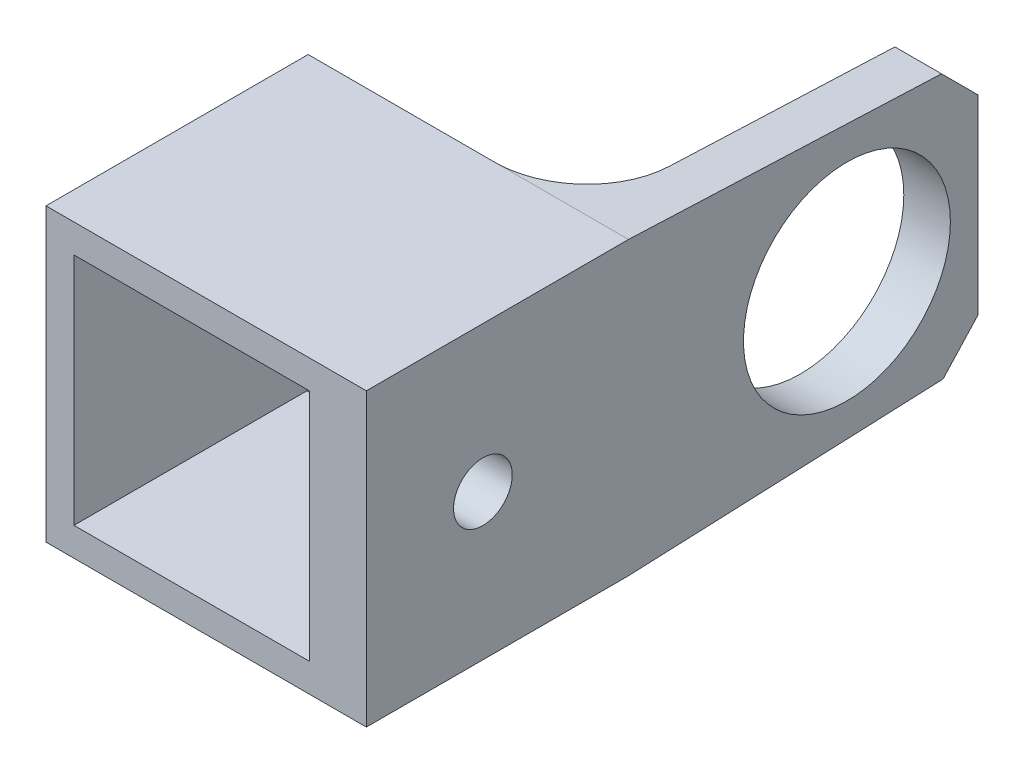
ISO-10303-21;
HEADER;
FILE_DESCRIPTION(('STEP AP214'),'2;1');
FILE_NAME('part.step','',(''),(''),'','','');
FILE_SCHEMA(('AUTOMOTIVE_DESIGN { 1 0 10303 214 1 1 1 1 }'));
ENDSEC;
DATA;
#1=APPLICATION_CONTEXT('core data for automotive mechanical design processes');
#2=APPLICATION_PROTOCOL_DEFINITION('international standard','automotive_design',2000,#1);
#3=PRODUCT_CONTEXT('',#1,'mechanical');
#4=PRODUCT('Part','Part','',(#3));
#5=PRODUCT_RELATED_PRODUCT_CATEGORY('part','',(#4));
#6=PRODUCT_DEFINITION_FORMATION('','',#4);
#7=PRODUCT_DEFINITION_CONTEXT('part definition',#1,'design');
#8=PRODUCT_DEFINITION('design','',#6,#7);
#9=PRODUCT_DEFINITION_SHAPE('','',#8);
#10=(LENGTH_UNIT() NAMED_UNIT(*) SI_UNIT(.MILLI.,.METRE.));
#11=(NAMED_UNIT(*) PLANE_ANGLE_UNIT() SI_UNIT($,.RADIAN.));
#12=(NAMED_UNIT(*) SI_UNIT($,.STERADIAN.) SOLID_ANGLE_UNIT());
#13=UNCERTAINTY_MEASURE_WITH_UNIT(LENGTH_MEASURE(1.E-05),#10,'distance_accuracy_value','');
#14=(GEOMETRIC_REPRESENTATION_CONTEXT(3) GLOBAL_UNCERTAINTY_ASSIGNED_CONTEXT((#13)) GLOBAL_UNIT_ASSIGNED_CONTEXT((#10,
#11,#12)) REPRESENTATION_CONTEXT('',''));
#15=CARTESIAN_POINT('',(0.,0.,0.));
#16=DIRECTION('',(0.,0.,1.));
#17=DIRECTION('',(1.,0.,0.));
#18=AXIS2_PLACEMENT_3D('',#15,#16,#17);
#19=CARTESIAN_POINT('',(-15.875,15.875,28.575));
#20=DIRECTION('',(0.,-1.,0.));
#21=DIRECTION('',(0.,0.,-1.));
#22=AXIS2_PLACEMENT_3D('',#19,#20,#21);
#23=PLANE('',#22);
#24=DIRECTION('',(-1.,0.,0.));
#25=VECTOR('',#24,1.);
#26=CARTESIAN_POINT('',(-15.875,15.875,0.));
#27=LINE('',#26,#25);
#28=CARTESIAN_POINT('',(19.05,15.875,0.));
#29=VERTEX_POINT('',#28);
#30=CARTESIAN_POINT('',(4.445,15.875,0.));
#31=VERTEX_POINT('',#30);
#32=EDGE_CURVE('E248',#29,#31,#27,.T.);
#33=ORIENTED_EDGE('',*,*,#32,.T.);
#34=CARTESIAN_POINT('',(-15.875,15.875,0.));
#35=VERTEX_POINT('',#34);
#36=EDGE_CURVE('E235',#31,#35,#27,.T.);
#37=ORIENTED_EDGE('',*,*,#36,.T.);
#38=DIRECTION('',(0.,0.,-1.));
#39=VECTOR('',#38,1.);
#40=CARTESIAN_POINT('',(-15.875,15.875,28.575));
#41=LINE('',#40,#39);
#42=CARTESIAN_POINT('',(-15.875,15.875,28.575));
#43=VERTEX_POINT('',#42);
#44=EDGE_CURVE('E259',#43,#35,#41,.T.);
#45=ORIENTED_EDGE('',*,*,#44,.F.);
#46=DIRECTION('',(-1.,0.,0.));
#47=VECTOR('',#46,1.);
#48=CARTESIAN_POINT('',(-15.875,15.875,28.575));
#49=LINE('',#48,#47);
#50=CARTESIAN_POINT('',(19.05,15.875,28.575));
#51=VERTEX_POINT('',#50);
#52=EDGE_CURVE('E242',#51,#43,#49,.T.);
#53=ORIENTED_EDGE('',*,*,#52,.F.);
#54=DIRECTION('',(0.,0.,1.));
#55=VECTOR('',#54,1.);
#56=CARTESIAN_POINT('',(19.05,15.875,28.575));
#57=LINE('',#56,#55);
#58=EDGE_CURVE('E179',#29,#51,#57,.T.);
#59=ORIENTED_EDGE('',*,*,#58,.F.);
#60=EDGE_LOOP('',(#33,#37,#45,#53,#59));
#61=FACE_BOUND('',#60,.T.);
#62=ADVANCED_FACE('F46',(#61),#23,.F.);
#63=CARTESIAN_POINT('',(-15.875,-15.875,28.575));
#64=DIRECTION('',(1.,0.,0.));
#65=DIRECTION('',(0.,0.,-1.));
#66=AXIS2_PLACEMENT_3D('',#63,#64,#65);
#67=PLANE('',#66);
#68=DIRECTION('',(0.,-1.,0.));
#69=VECTOR('',#68,1.);
#70=CARTESIAN_POINT('',(-15.875,-15.875,0.));
#71=LINE('',#70,#69);
#72=CARTESIAN_POINT('',(-15.875,-15.875,0.));
#73=VERTEX_POINT('',#72);
#74=EDGE_CURVE('E252',#35,#73,#71,.T.);
#75=ORIENTED_EDGE('',*,*,#74,.T.);
#76=DIRECTION('',(0.,0.,-1.));
#77=VECTOR('',#76,1.);
#78=CARTESIAN_POINT('',(-15.875,-15.875,28.575));
#79=LINE('',#78,#77);
#80=CARTESIAN_POINT('',(-15.875,-15.875,28.575));
#81=VERTEX_POINT('',#80);
#82=EDGE_CURVE('E162',#81,#73,#79,.T.);
#83=ORIENTED_EDGE('',*,*,#82,.F.);
#84=DIRECTION('',(0.,-1.,0.));
#85=VECTOR('',#84,1.);
#86=CARTESIAN_POINT('',(-15.875,-15.875,28.575));
#87=LINE('',#86,#85);
#88=EDGE_CURVE('E158',#43,#81,#87,.T.);
#89=ORIENTED_EDGE('',*,*,#88,.F.);
#90=ORIENTED_EDGE('',*,*,#44,.T.);
#91=EDGE_LOOP('',(#75,#83,#89,#90));
#92=FACE_BOUND('',#91,.T.);
#93=ADVANCED_FACE('F378',(#92),#67,.F.);
#94=CARTESIAN_POINT('',(-15.875,-15.875,28.575));
#95=DIRECTION('',(0.,1.,0.));
#96=DIRECTION('',(0.,0.,1.));
#97=AXIS2_PLACEMENT_3D('',#94,#95,#96);
#98=PLANE('',#97);
#99=DIRECTION('',(1.,0.,0.));
#100=VECTOR('',#99,1.);
#101=CARTESIAN_POINT('',(-15.875,-15.875,0.));
#102=LINE('',#101,#100);
#103=CARTESIAN_POINT('',(4.445,-15.875,0.));
#104=VERTEX_POINT('',#103);
#105=EDGE_CURVE('E249',#73,#104,#102,.T.);
#106=ORIENTED_EDGE('',*,*,#105,.T.);
#107=DIRECTION('',(-1.,0.,0.));
#108=VECTOR('',#107,1.);
#109=CARTESIAN_POINT('',(19.05,-15.875,0.));
#110=LINE('',#109,#108);
#111=CARTESIAN_POINT('',(19.05,-15.875,0.));
#112=VERTEX_POINT('',#111);
#113=EDGE_CURVE('E166',#112,#104,#110,.T.);
#114=ORIENTED_EDGE('',*,*,#113,.F.);
#115=DIRECTION('',(0.,0.,-1.));
#116=VECTOR('',#115,1.);
#117=CARTESIAN_POINT('',(19.05,-15.875,28.575));
#118=LINE('',#117,#116);
#119=CARTESIAN_POINT('',(19.05,-15.875,28.575));
#120=VERTEX_POINT('',#119);
#121=EDGE_CURVE('E167',#120,#112,#118,.T.);
#122=ORIENTED_EDGE('',*,*,#121,.F.);
#123=DIRECTION('',(1.,0.,0.));
#124=VECTOR('',#123,1.);
#125=CARTESIAN_POINT('',(-15.875,-15.875,28.575));
#126=LINE('',#125,#124);
#127=EDGE_CURVE('E155',#81,#120,#126,.T.);
#128=ORIENTED_EDGE('',*,*,#127,.F.);
#129=ORIENTED_EDGE('',*,*,#82,.T.);
#130=EDGE_LOOP('',(#106,#114,#122,#128,#129));
#131=FACE_BOUND('',#130,.T.);
#132=ADVANCED_FACE('F169',(#131),#98,.F.);
#133=CARTESIAN_POINT('',(0.,0.,28.575));
#134=DIRECTION('',(0.,0.,-1.));
#135=DIRECTION('',(-1.,0.,0.));
#136=AXIS2_PLACEMENT_3D('',#133,#134,#135);
#137=PLANE('',#136);
#138=DIRECTION('',(-1.,0.,0.));
#139=VECTOR('',#138,1.);
#140=CARTESIAN_POINT('',(-12.827,12.7635,28.575));
#141=LINE('',#140,#139);
#142=CARTESIAN_POINT('',(12.827,12.7635,28.575));
#143=VERTEX_POINT('',#142);
#144=CARTESIAN_POINT('',(-12.827,12.7635,28.575));
#145=VERTEX_POINT('',#144);
#146=EDGE_CURVE('E218',#143,#145,#141,.T.);
#147=ORIENTED_EDGE('',*,*,#146,.F.);
#148=DIRECTION('',(0.,1.,0.));
#149=VECTOR('',#148,1.);
#150=CARTESIAN_POINT('',(12.827,-12.7635,28.575));
#151=LINE('',#150,#149);
#152=CARTESIAN_POINT('',(12.827,-12.7635,28.575));
#153=VERTEX_POINT('',#152);
#154=EDGE_CURVE('E196',#153,#143,#151,.T.);
#155=ORIENTED_EDGE('',*,*,#154,.F.);
#156=DIRECTION('',(1.,0.,0.));
#157=VECTOR('',#156,1.);
#158=CARTESIAN_POINT('',(-12.827,-12.7635,28.575));
#159=LINE('',#158,#157);
#160=CARTESIAN_POINT('',(-12.827,-12.7635,28.575));
#161=VERTEX_POINT('',#160);
#162=EDGE_CURVE('E204',#161,#153,#159,.T.);
#163=ORIENTED_EDGE('',*,*,#162,.F.);
#164=DIRECTION('',(0.,-1.,0.));
#165=VECTOR('',#164,1.);
#166=CARTESIAN_POINT('',(-12.827,-12.7635,28.575));
#167=LINE('',#166,#165);
#168=EDGE_CURVE('E224',#145,#161,#167,.T.);
#169=ORIENTED_EDGE('',*,*,#168,.F.);
#170=EDGE_LOOP('',(#147,#155,#163,#169));
#171=FACE_BOUND('',#170,.T.);
#172=ORIENTED_EDGE('',*,*,#127,.T.);
#173=DIRECTION('',(0.,-1.,0.));
#174=VECTOR('',#173,1.);
#175=CARTESIAN_POINT('',(19.05,-15.875,28.575));
#176=LINE('',#175,#174);
#177=EDGE_CURVE('E156',#51,#120,#176,.T.);
#178=ORIENTED_EDGE('',*,*,#177,.F.);
#179=ORIENTED_EDGE('',*,*,#52,.T.);
#180=ORIENTED_EDGE('',*,*,#88,.T.);
#181=EDGE_LOOP('',(#172,#178,#179,#180));
#182=FACE_BOUND('',#181,.T.);
#183=ADVANCED_FACE('F152',(#171,#182),#137,.F.);
#184=CARTESIAN_POINT('',(0.,0.,0.));
#185=DIRECTION('',(0.,0.,-1.));
#186=DIRECTION('',(-1.,0.,0.));
#187=AXIS2_PLACEMENT_3D('',#184,#185,#186);
#188=PLANE('',#187);
#189=ORIENTED_EDGE('',*,*,#36,.F.);
#190=DIRECTION('',(0.,1.,0.));
#191=VECTOR('',#190,1.);
#192=CARTESIAN_POINT('',(4.445,-15.875,0.));
#193=LINE('',#192,#191);
#194=EDGE_CURVE('E270',#31,#104,#193,.F.);
#195=ORIENTED_EDGE('',*,*,#194,.T.);
#196=ORIENTED_EDGE('',*,*,#105,.F.);
#197=ORIENTED_EDGE('',*,*,#74,.F.);
#198=EDGE_LOOP('',(#189,#195,#196,#197));
#199=FACE_BOUND('',#198,.T.);
#200=ADVANCED_FACE('F353',(#199),#188,.T.);
#201=CARTESIAN_POINT('',(12.827,-12.7635,3.175));
#202=DIRECTION('',(1.,0.,0.));
#203=DIRECTION('',(0.,0.,-1.));
#204=AXIS2_PLACEMENT_3D('',#201,#202,#203);
#205=PLANE('',#204);
#206=CARTESIAN_POINT('',(12.827,0.,15.875));
#207=DIRECTION('',(1.,0.,0.));
#208=DIRECTION('',(0.,0.,-1.));
#209=AXIS2_PLACEMENT_3D('',#206,#207,#208);
#210=CIRCLE('',#209,3.2004);
#211=CARTESIAN_POINT('',(12.827,0.,12.6746));
#212=VERTEX_POINT('',#211);
#213=EDGE_CURVE('E325',#212,#212,#210,.F.);
#214=ORIENTED_EDGE('',*,*,#213,.F.);
#215=EDGE_LOOP('',(#214));
#216=FACE_BOUND('',#215,.T.);
#217=ORIENTED_EDGE('',*,*,#154,.T.);
#218=DIRECTION('',(0.,0.,1.));
#219=VECTOR('',#218,1.);
#220=CARTESIAN_POINT('',(12.827,12.7635,3.175));
#221=LINE('',#220,#219);
#222=CARTESIAN_POINT('',(12.827,12.7635,3.175));
#223=VERTEX_POINT('',#222);
#224=EDGE_CURVE('E216',#223,#143,#221,.T.);
#225=ORIENTED_EDGE('',*,*,#224,.F.);
#226=DIRECTION('',(0.,1.,0.));
#227=VECTOR('',#226,1.);
#228=CARTESIAN_POINT('',(12.827,-12.7635,3.175));
#229=LINE('',#228,#227);
#230=CARTESIAN_POINT('',(12.827,-12.7635,3.175));
#231=VERTEX_POINT('',#230);
#232=EDGE_CURVE('E200',#231,#223,#229,.T.);
#233=ORIENTED_EDGE('',*,*,#232,.F.);
#234=DIRECTION('',(0.,0.,1.));
#235=VECTOR('',#234,1.);
#236=CARTESIAN_POINT('',(12.827,-12.7635,3.175));
#237=LINE('',#236,#235);
#238=EDGE_CURVE('E226',#231,#153,#237,.T.);
#239=ORIENTED_EDGE('',*,*,#238,.T.);
#240=EDGE_LOOP('',(#217,#225,#233,#239));
#241=FACE_BOUND('',#240,.T.);
#242=ADVANCED_FACE('F350',(#216,#241),#205,.F.);
#243=CARTESIAN_POINT('',(-12.827,-12.7635,3.175));
#244=DIRECTION('',(0.,-1.,0.));
#245=DIRECTION('',(0.,0.,-1.));
#246=AXIS2_PLACEMENT_3D('',#243,#244,#245);
#247=PLANE('',#246);
#248=ORIENTED_EDGE('',*,*,#162,.T.);
#249=ORIENTED_EDGE('',*,*,#238,.F.);
#250=DIRECTION('',(1.,0.,0.));
#251=VECTOR('',#250,1.);
#252=CARTESIAN_POINT('',(-12.827,-12.7635,3.175));
#253=LINE('',#252,#251);
#254=CARTESIAN_POINT('',(-12.827,-12.7635,3.175));
#255=VERTEX_POINT('',#254);
#256=EDGE_CURVE('E215',#255,#231,#253,.T.);
#257=ORIENTED_EDGE('',*,*,#256,.F.);
#258=DIRECTION('',(0.,0.,1.));
#259=VECTOR('',#258,1.);
#260=CARTESIAN_POINT('',(-12.827,-12.7635,3.175));
#261=LINE('',#260,#259);
#262=EDGE_CURVE('E233',#255,#161,#261,.T.);
#263=ORIENTED_EDGE('',*,*,#262,.T.);
#264=EDGE_LOOP('',(#248,#249,#257,#263));
#265=FACE_BOUND('',#264,.T.);
#266=ADVANCED_FACE('F348',(#265),#247,.F.);
#267=CARTESIAN_POINT('',(-12.827,-12.7635,3.175));
#268=DIRECTION('',(-1.,0.,0.));
#269=DIRECTION('',(0.,0.,1.));
#270=AXIS2_PLACEMENT_3D('',#267,#268,#269);
#271=PLANE('',#270);
#272=ORIENTED_EDGE('',*,*,#168,.T.);
#273=ORIENTED_EDGE('',*,*,#262,.F.);
#274=DIRECTION('',(0.,-1.,0.));
#275=VECTOR('',#274,1.);
#276=CARTESIAN_POINT('',(-12.827,-12.7635,3.175));
#277=LINE('',#276,#275);
#278=CARTESIAN_POINT('',(-12.827,12.7635,3.175));
#279=VERTEX_POINT('',#278);
#280=EDGE_CURVE('E208',#279,#255,#277,.T.);
#281=ORIENTED_EDGE('',*,*,#280,.F.);
#282=DIRECTION('',(0.,0.,1.));
#283=VECTOR('',#282,1.);
#284=CARTESIAN_POINT('',(-12.827,12.7635,3.175));
#285=LINE('',#284,#283);
#286=EDGE_CURVE('E240',#279,#145,#285,.T.);
#287=ORIENTED_EDGE('',*,*,#286,.T.);
#288=EDGE_LOOP('',(#272,#273,#281,#287));
#289=FACE_BOUND('',#288,.T.);
#290=ADVANCED_FACE('F361',(#289),#271,.F.);
#291=CARTESIAN_POINT('',(-12.827,12.7635,3.175));
#292=DIRECTION('',(0.,1.,0.));
#293=DIRECTION('',(0.,0.,1.));
#294=AXIS2_PLACEMENT_3D('',#291,#292,#293);
#295=PLANE('',#294);
#296=ORIENTED_EDGE('',*,*,#146,.T.);
#297=ORIENTED_EDGE('',*,*,#286,.F.);
#298=DIRECTION('',(-1.,0.,0.));
#299=VECTOR('',#298,1.);
#300=CARTESIAN_POINT('',(-12.827,12.7635,3.175));
#301=LINE('',#300,#299);
#302=EDGE_CURVE('E201',#223,#279,#301,.T.);
#303=ORIENTED_EDGE('',*,*,#302,.F.);
#304=ORIENTED_EDGE('',*,*,#224,.T.);
#305=EDGE_LOOP('',(#296,#297,#303,#304));
#306=FACE_BOUND('',#305,.T.);
#307=ADVANCED_FACE('F357',(#306),#295,.F.);
#308=CARTESIAN_POINT('',(0.,0.,3.175));
#309=DIRECTION('',(0.,0.,-1.));
#310=DIRECTION('',(-1.,0.,0.));
#311=AXIS2_PLACEMENT_3D('',#308,#309,#310);
#312=PLANE('',#311);
#313=ORIENTED_EDGE('',*,*,#232,.T.);
#314=ORIENTED_EDGE('',*,*,#302,.T.);
#315=ORIENTED_EDGE('',*,*,#280,.T.);
#316=ORIENTED_EDGE('',*,*,#256,.T.);
#317=EDGE_LOOP('',(#313,#314,#315,#316));
#318=FACE_BOUND('',#317,.T.);
#319=ADVANCED_FACE('F370',(#318),#312,.F.);
#320=CARTESIAN_POINT('',(19.05,-14.2875,-38.1));
#321=DIRECTION('',(0.,0.999133073092352,0.0416305447121808));
#322=DIRECTION('',(0.,-0.0416305447121808,0.999133073092352));
#323=AXIS2_PLACEMENT_3D('',#320,#321,#322);
#324=PLANE('',#323);
#325=DIRECTION('',(0.,-0.0416305447121808,0.999133073092352));
#326=VECTOR('',#325,1.);
#327=CARTESIAN_POINT('',(13.97,-14.2875,-38.1));
#328=LINE('',#327,#326);
#329=CARTESIAN_POINT('',(13.97,-14.4461123753534,-34.2933029915181));
#330=VERTEX_POINT('',#329);
#331=CARTESIAN_POINT('',(13.97,-15.478125,-9.525));
#332=VERTEX_POINT('',#331);
#333=EDGE_CURVE('E185',#330,#332,#328,.T.);
#334=ORIENTED_EDGE('',*,*,#333,.F.);
#335=DIRECTION('',(1.,0.,0.));
#336=VECTOR('',#335,1.);
#337=CARTESIAN_POINT('',(19.05,-14.4461123753534,-34.2933029915181));
#338=LINE('',#337,#336);
#339=CARTESIAN_POINT('',(19.05,-14.4461123753534,-34.2933029915181));
#340=VERTEX_POINT('',#339);
#341=EDGE_CURVE('E72',#330,#340,#338,.T.);
#342=ORIENTED_EDGE('',*,*,#341,.T.);
#343=DIRECTION('',(0.,0.0416305447121808,-0.999133073092352));
#344=VECTOR('',#343,1.);
#345=CARTESIAN_POINT('',(19.05,-14.2875,-38.1));
#346=LINE('',#345,#344);
#347=EDGE_CURVE('E173',#112,#340,#346,.T.);
#348=ORIENTED_EDGE('',*,*,#347,.F.);
#349=ORIENTED_EDGE('',*,*,#113,.T.);
#350=CARTESIAN_POINT('',(4.445,-15.478125,-9.525));
#351=DIRECTION('',(0.,0.999133073092352,0.0416305447121808));
#352=DIRECTION('',(0.,-0.0416305447121808,0.999133073092352));
#353=AXIS2_PLACEMENT_3D('',#350,#351,#352);
#354=ELLIPSE('',#353,9.5332646436373,9.525);
#355=EDGE_CURVE('E274',#104,#332,#354,.T.);
#356=ORIENTED_EDGE('',*,*,#355,.T.);
#357=EDGE_LOOP('',(#334,#342,#348,#349,#356));
#358=FACE_BOUND('',#357,.T.);
#359=ADVANCED_FACE('F310',(#358),#324,.F.);
#360=CARTESIAN_POINT('',(19.05,14.2875,-38.1));
#361=DIRECTION('',(0.,0.,1.));
#362=DIRECTION('',(1.,0.,0.));
#363=AXIS2_PLACEMENT_3D('',#360,#361,#362);
#364=PLANE('',#363);
#365=DIRECTION('',(0.,1.,0.));
#366=VECTOR('',#365,1.);
#367=CARTESIAN_POINT('',(19.05,14.2875,-38.1));
#368=LINE('',#367,#366);
#369=CARTESIAN_POINT('',(19.05,-10.3083982356992,-38.1));
#370=VERTEX_POINT('',#369);
#371=CARTESIAN_POINT('',(19.05,10.4775,-38.1));
#372=VERTEX_POINT('',#371);
#373=EDGE_CURVE('E187',#370,#372,#368,.T.);
#374=ORIENTED_EDGE('',*,*,#373,.F.);
#375=DIRECTION('',(-1.,0.,0.));
#376=VECTOR('',#375,1.);
#377=CARTESIAN_POINT('',(19.05,-10.3083982356992,-38.1));
#378=LINE('',#377,#376);
#379=CARTESIAN_POINT('',(13.97,-10.3083982356992,-38.1));
#380=VERTEX_POINT('',#379);
#381=EDGE_CURVE('E284',#370,#380,#378,.T.);
#382=ORIENTED_EDGE('',*,*,#381,.T.);
#383=DIRECTION('',(0.,-1.,0.));
#384=VECTOR('',#383,1.);
#385=CARTESIAN_POINT('',(13.97,14.2875,-38.1));
#386=LINE('',#385,#384);
#387=CARTESIAN_POINT('',(13.97,10.4775,-38.1));
#388=VERTEX_POINT('',#387);
#389=EDGE_CURVE('E306',#388,#380,#386,.T.);
#390=ORIENTED_EDGE('',*,*,#389,.F.);
#391=DIRECTION('',(1.,0.,0.));
#392=VECTOR('',#391,1.);
#393=CARTESIAN_POINT('',(19.05,10.4775,-38.1));
#394=LINE('',#393,#392);
#395=EDGE_CURVE('E276',#388,#372,#394,.T.);
#396=ORIENTED_EDGE('',*,*,#395,.T.);
#397=EDGE_LOOP('',(#374,#382,#390,#396));
#398=FACE_BOUND('',#397,.T.);
#399=ADVANCED_FACE('F304',(#398),#364,.F.);
#400=CARTESIAN_POINT('',(19.05,15.875,0.));
#401=DIRECTION('',(0.,-0.999133073092352,0.0416305447121819));
#402=DIRECTION('',(0.,-0.0416305447121819,-0.999133073092352));
#403=AXIS2_PLACEMENT_3D('',#400,#401,#402);
#404=PLANE('',#403);
#405=DIRECTION('',(0.,0.0416305447121819,0.999133073092352));
#406=VECTOR('',#405,1.);
#407=CARTESIAN_POINT('',(19.05,15.875,0.));
#408=LINE('',#407,#406);
#409=CARTESIAN_POINT('',(19.05,14.453152173913,-34.124347826087));
#410=VERTEX_POINT('',#409);
#411=EDGE_CURVE('E194',#410,#29,#408,.T.);
#412=ORIENTED_EDGE('',*,*,#411,.F.);
#413=DIRECTION('',(-1.,0.,0.));
#414=VECTOR('',#413,1.);
#415=CARTESIAN_POINT('',(19.05,14.453152173913,-34.124347826087));
#416=LINE('',#415,#414);
#417=CARTESIAN_POINT('',(13.97,14.453152173913,-34.124347826087));
#418=VERTEX_POINT('',#417);
#419=EDGE_CURVE('E11',#410,#418,#416,.T.);
#420=ORIENTED_EDGE('',*,*,#419,.T.);
#421=DIRECTION('',(0.,-0.0416305447121819,-0.999133073092352));
#422=VECTOR('',#421,1.);
#423=CARTESIAN_POINT('',(13.97,15.875,0.));
#424=LINE('',#423,#422);
#425=CARTESIAN_POINT('',(13.97,15.478125,-9.525));
#426=VERTEX_POINT('',#425);
#427=EDGE_CURVE('E180',#426,#418,#424,.T.);
#428=ORIENTED_EDGE('',*,*,#427,.F.);
#429=CARTESIAN_POINT('',(4.445,15.478125,-9.525));
#430=DIRECTION('',(0.,-0.999133073092352,0.0416305447121819));
#431=DIRECTION('',(0.,-0.0416305447121819,-0.999133073092352));
#432=AXIS2_PLACEMENT_3D('',#429,#430,#431);
#433=ELLIPSE('',#432,9.5332646436373,9.525);
#434=EDGE_CURVE('E271',#426,#31,#433,.T.);
#435=ORIENTED_EDGE('',*,*,#434,.T.);
#436=ORIENTED_EDGE('',*,*,#32,.F.);
#437=EDGE_LOOP('',(#412,#420,#428,#435,#436));
#438=FACE_BOUND('',#437,.T.);
#439=ADVANCED_FACE('F339',(#438),#404,.F.);
#440=CARTESIAN_POINT('',(19.05,0.,0.));
#441=DIRECTION('',(-1.,0.,0.));
#442=DIRECTION('',(0.,0.,1.));
#443=AXIS2_PLACEMENT_3D('',#440,#441,#442);
#444=PLANE('',#443);
#445=CARTESIAN_POINT('',(19.05,0.,-23.8125));
#446=DIRECTION('',(1.,0.,0.));
#447=DIRECTION('',(0.,0.,-1.));
#448=AXIS2_PLACEMENT_3D('',#445,#446,#447);
#449=CIRCLE('',#448,11.2776);
#450=CARTESIAN_POINT('',(19.05,0.,-35.0901));
#451=VERTEX_POINT('',#450);
#452=EDGE_CURVE('E314',#451,#451,#449,.T.);
#453=ORIENTED_EDGE('',*,*,#452,.F.);
#454=EDGE_LOOP('',(#453));
#455=FACE_BOUND('',#454,.T.);
#456=CARTESIAN_POINT('',(19.05,0.,15.875));
#457=DIRECTION('',(1.,0.,0.));
#458=DIRECTION('',(0.,0.,-1.));
#459=AXIS2_PLACEMENT_3D('',#456,#457,#458);
#460=CIRCLE('',#459,3.2004);
#461=CARTESIAN_POINT('',(19.05,0.,12.6746));
#462=VERTEX_POINT('',#461);
#463=EDGE_CURVE('E320',#462,#462,#460,.T.);
#464=ORIENTED_EDGE('',*,*,#463,.F.);
#465=EDGE_LOOP('',(#464));
#466=FACE_BOUND('',#465,.T.);
#467=ORIENTED_EDGE('',*,*,#347,.T.);
#468=DIRECTION('',(0.,-0.735931011761828,0.677056530820885));
#469=VECTOR('',#468,1.);
#470=CARTESIAN_POINT('',(19.05,-10.3083982356992,-38.1));
#471=LINE('',#470,#469);
#472=EDGE_CURVE('E57',#340,#370,#471,.F.);
#473=ORIENTED_EDGE('',*,*,#472,.T.);
#474=ORIENTED_EDGE('',*,*,#373,.T.);
#475=DIRECTION('',(0.,-0.707106781186549,-0.707106781186546));
#476=VECTOR('',#475,1.);
#477=CARTESIAN_POINT('',(19.05,14.453152173913,-34.124347826087));
#478=LINE('',#477,#476);
#479=EDGE_CURVE('E62',#372,#410,#478,.F.);
#480=ORIENTED_EDGE('',*,*,#479,.T.);
#481=ORIENTED_EDGE('',*,*,#411,.T.);
#482=ORIENTED_EDGE('',*,*,#58,.T.);
#483=ORIENTED_EDGE('',*,*,#177,.T.);
#484=ORIENTED_EDGE('',*,*,#121,.T.);
#485=EDGE_LOOP('',(#467,#473,#474,#480,#481,#482,#483,#484));
#486=FACE_BOUND('',#485,.T.);
#487=ADVANCED_FACE('F175',(#455,#466,#486),#444,.F.);
#488=CARTESIAN_POINT('',(13.97,0.,0.));
#489=DIRECTION('',(-1.,0.,0.));
#490=DIRECTION('',(0.,0.,1.));
#491=AXIS2_PLACEMENT_3D('',#488,#489,#490);
#492=PLANE('',#491);
#493=CARTESIAN_POINT('',(13.97,0.,-23.8125));
#494=DIRECTION('',(-1.,0.,0.));
#495=DIRECTION('',(0.,0.,1.));
#496=AXIS2_PLACEMENT_3D('',#493,#494,#495);
#497=CIRCLE('',#496,11.2776);
#498=CARTESIAN_POINT('',(13.97,0.,-12.5349));
#499=VERTEX_POINT('',#498);
#500=EDGE_CURVE('E321',#499,#499,#497,.F.);
#501=ORIENTED_EDGE('',*,*,#500,.T.);
#502=EDGE_LOOP('',(#501));
#503=FACE_BOUND('',#502,.T.);
#504=ORIENTED_EDGE('',*,*,#389,.T.);
#505=DIRECTION('',(0.,0.735931011761828,-0.677056530820885));
#506=VECTOR('',#505,1.);
#507=CARTESIAN_POINT('',(13.97,-23.7093957250303,-25.7710823098154));
#508=LINE('',#507,#506);
#509=EDGE_CURVE('E288',#380,#330,#508,.F.);
#510=ORIENTED_EDGE('',*,*,#509,.T.);
#511=ORIENTED_EDGE('',*,*,#333,.T.);
#512=DIRECTION('',(0.,1.,0.));
#513=VECTOR('',#512,1.);
#514=CARTESIAN_POINT('',(13.97,15.875,-9.525));
#515=LINE('',#514,#513);
#516=EDGE_CURVE('E263',#332,#426,#515,.T.);
#517=ORIENTED_EDGE('',*,*,#516,.T.);
#518=ORIENTED_EDGE('',*,*,#427,.T.);
#519=DIRECTION('',(0.,0.707106781186549,0.707106781186546));
#520=VECTOR('',#519,1.);
#521=CARTESIAN_POINT('',(13.97,24.28875,-24.2887500000001));
#522=LINE('',#521,#520);
#523=EDGE_CURVE('E289',#418,#388,#522,.F.);
#524=ORIENTED_EDGE('',*,*,#523,.T.);
#525=EDGE_LOOP('',(#504,#510,#511,#517,#518,#524));
#526=FACE_BOUND('',#525,.T.);
#527=ADVANCED_FACE('F307',(#503,#526),#492,.T.);
#528=CARTESIAN_POINT('',(4.445,0.,-9.525));
#529=DIRECTION('',(0.,-1.,0.));
#530=DIRECTION('',(0.,0.,-1.));
#531=AXIS2_PLACEMENT_3D('',#528,#529,#530);
#532=CYLINDRICAL_SURFACE('',#531,9.525);
#533=ORIENTED_EDGE('',*,*,#355,.F.);
#534=ORIENTED_EDGE('',*,*,#194,.F.);
#535=ORIENTED_EDGE('',*,*,#434,.F.);
#536=ORIENTED_EDGE('',*,*,#516,.F.);
#537=EDGE_LOOP('',(#533,#534,#535,#536));
#538=FACE_BOUND('',#537,.T.);
#539=ADVANCED_FACE('F386',(#538),#532,.F.);
#540=CARTESIAN_POINT('',(-15.876,0.,-23.8125));
#541=DIRECTION('',(1.,0.,0.));
#542=DIRECTION('',(0.,0.,-1.));
#543=AXIS2_PLACEMENT_3D('',#540,#541,#542);
#544=CYLINDRICAL_SURFACE('',#543,11.2776);
#545=ORIENTED_EDGE('',*,*,#500,.F.);
#546=EDGE_LOOP('',(#545));
#547=FACE_BOUND('',#546,.T.);
#548=ORIENTED_EDGE('',*,*,#452,.T.);
#549=EDGE_LOOP('',(#548));
#550=FACE_BOUND('',#549,.T.);
#551=ADVANCED_FACE('F334',(#547,#550),#544,.F.);
#552=CARTESIAN_POINT('',(-15.876,0.,15.875));
#553=DIRECTION('',(1.,0.,0.));
#554=DIRECTION('',(0.,0.,-1.));
#555=AXIS2_PLACEMENT_3D('',#552,#553,#554);
#556=CYLINDRICAL_SURFACE('',#555,3.2004);
#557=ORIENTED_EDGE('',*,*,#463,.T.);
#558=EDGE_LOOP('',(#557));
#559=FACE_BOUND('',#558,.T.);
#560=ORIENTED_EDGE('',*,*,#213,.T.);
#561=EDGE_LOOP('',(#560));
#562=FACE_BOUND('',#561,.T.);
#563=ADVANCED_FACE('F344',(#559,#562),#556,.F.);
#564=CARTESIAN_POINT('',(19.05,-10.3083982356992,-38.1));
#565=DIRECTION('',(0.,0.677056530820885,0.735931011761828));
#566=DIRECTION('',(-1.,0.,0.));
#567=AXIS2_PLACEMENT_3D('',#564,#565,#566);
#568=PLANE('',#567);
#569=ORIENTED_EDGE('',*,*,#472,.F.);
#570=ORIENTED_EDGE('',*,*,#341,.F.);
#571=ORIENTED_EDGE('',*,*,#509,.F.);
#572=ORIENTED_EDGE('',*,*,#381,.F.);
#573=EDGE_LOOP('',(#569,#570,#571,#572));
#574=FACE_BOUND('',#573,.T.);
#575=ADVANCED_FACE('F302',(#574),#568,.F.);
#576=CARTESIAN_POINT('',(19.05,14.453152173913,-34.124347826087));
#577=DIRECTION('',(0.,-0.707106781186546,0.707106781186549));
#578=DIRECTION('',(-1.,0.,0.));
#579=AXIS2_PLACEMENT_3D('',#576,#577,#578);
#580=PLANE('',#579);
#581=ORIENTED_EDGE('',*,*,#479,.F.);
#582=ORIENTED_EDGE('',*,*,#395,.F.);
#583=ORIENTED_EDGE('',*,*,#523,.F.);
#584=ORIENTED_EDGE('',*,*,#419,.F.);
#585=EDGE_LOOP('',(#581,#582,#583,#584));
#586=FACE_BOUND('',#585,.T.);
#587=ADVANCED_FACE('F47',(#586),#580,.F.);
#588=CLOSED_SHELL('',(#62,#93,#132,#183,#200,#242,#266,#290,#307,#319,#359,#399,#439,#487,#527,
#539,#551,#563,#575,#587));
#589=MANIFOLD_SOLID_BREP('B2',#588);
#590=ADVANCED_BREP_SHAPE_REPRESENTATION('',(#18,#589),#14);
#591=SHAPE_DEFINITION_REPRESENTATION(#9,#590);
ENDSEC;
END-ISO-10303-21;
